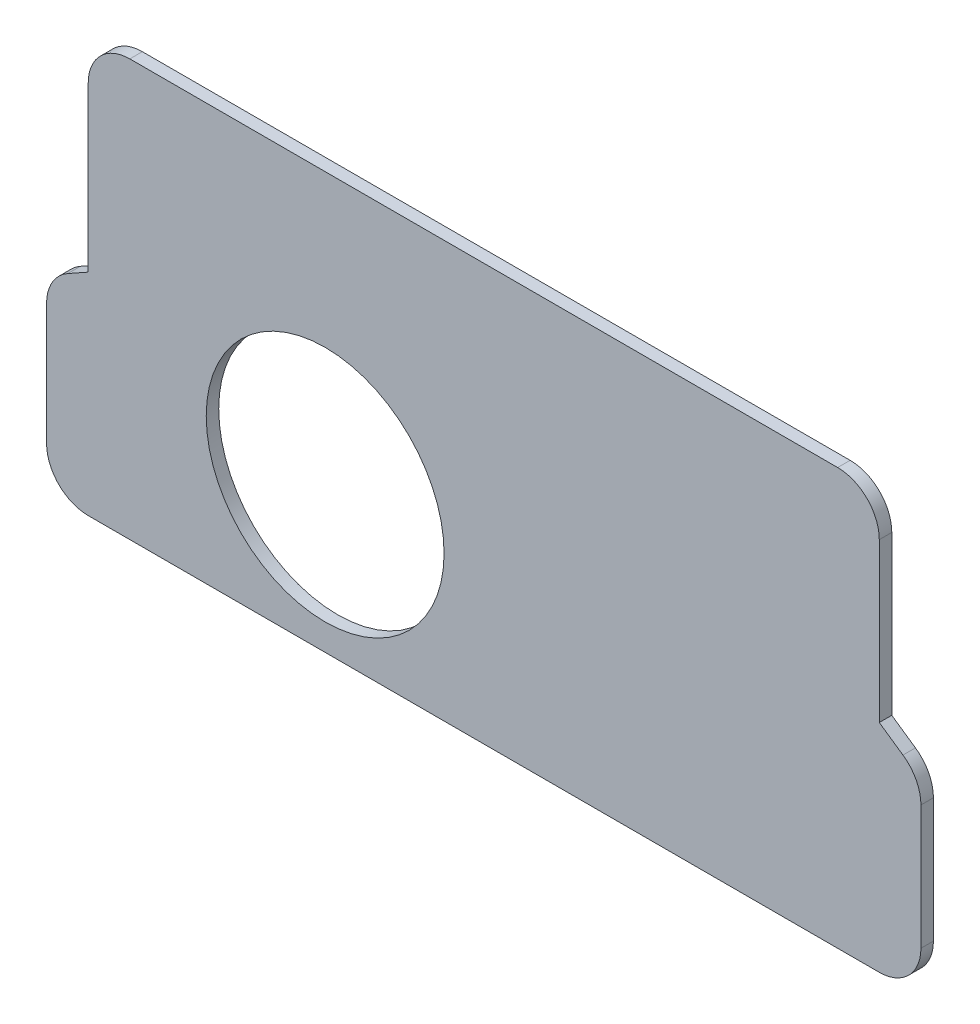
ISO-10303-21;
HEADER;
FILE_DESCRIPTION(('STEP AP214'),'2;1');
FILE_NAME('part.step','',(''),(''),'','','');
FILE_SCHEMA(('AUTOMOTIVE_DESIGN { 1 0 10303 214 1 1 1 1 }'));
ENDSEC;
DATA;
#1=APPLICATION_CONTEXT('core data for automotive mechanical design processes');
#2=APPLICATION_PROTOCOL_DEFINITION('international standard','automotive_design',2000,#1);
#3=PRODUCT_CONTEXT('',#1,'mechanical');
#4=PRODUCT('Part','Part','',(#3));
#5=PRODUCT_RELATED_PRODUCT_CATEGORY('part','',(#4));
#6=PRODUCT_DEFINITION_FORMATION('','',#4);
#7=PRODUCT_DEFINITION_CONTEXT('part definition',#1,'design');
#8=PRODUCT_DEFINITION('design','',#6,#7);
#9=PRODUCT_DEFINITION_SHAPE('','',#8);
#10=(LENGTH_UNIT() NAMED_UNIT(*) SI_UNIT(.MILLI.,.METRE.));
#11=(NAMED_UNIT(*) PLANE_ANGLE_UNIT() SI_UNIT($,.RADIAN.));
#12=(NAMED_UNIT(*) SI_UNIT($,.STERADIAN.) SOLID_ANGLE_UNIT());
#13=UNCERTAINTY_MEASURE_WITH_UNIT(LENGTH_MEASURE(1.E-05),#10,'distance_accuracy_value','');
#14=(GEOMETRIC_REPRESENTATION_CONTEXT(3) GLOBAL_UNCERTAINTY_ASSIGNED_CONTEXT((#13)) GLOBAL_UNIT_ASSIGNED_CONTEXT((#10,
#11,#12)) REPRESENTATION_CONTEXT('',''));
#15=CARTESIAN_POINT('',(0.,0.,0.));
#16=DIRECTION('',(0.,0.,1.));
#17=DIRECTION('',(1.,0.,0.));
#18=AXIS2_PLACEMENT_3D('',#15,#16,#17);
#19=CARTESIAN_POINT('',(200.,10.,3.));
#20=DIRECTION('',(0.,0.,-1.));
#21=DIRECTION('',(-1.,0.,0.));
#22=AXIS2_PLACEMENT_3D('',#19,#20,#21);
#23=PLANE('',#22);
#24=CARTESIAN_POINT('',(200.,10.,3.));
#25=DIRECTION('',(0.,0.,1.));
#26=DIRECTION('',(-1.,0.,0.));
#27=AXIS2_PLACEMENT_3D('',#24,#25,#26);
#28=CIRCLE('',#27,10.);
#29=CARTESIAN_POINT('',(200.,0.,3.));
#30=VERTEX_POINT('',#29);
#31=CARTESIAN_POINT('',(210.,10.,3.));
#32=VERTEX_POINT('',#31);
#33=EDGE_CURVE('E201',#30,#32,#28,.T.);
#34=ORIENTED_EDGE('',*,*,#33,.T.);
#35=DIRECTION('',(0.,1.,0.));
#36=VECTOR('',#35,1.);
#37=CARTESIAN_POINT('',(210.,39.8097786950727,3.));
#38=LINE('',#37,#36);
#39=CARTESIAN_POINT('',(210.,39.8097786950727,3.));
#40=VERTEX_POINT('',#39);
#41=EDGE_CURVE('E119',#32,#40,#38,.T.);
#42=ORIENTED_EDGE('',*,*,#41,.T.);
#43=CARTESIAN_POINT('',(200.,39.8097786950727,3.));
#44=DIRECTION('',(0.,0.,1.));
#45=DIRECTION('',(-1.,0.,0.));
#46=AXIS2_PLACEMENT_3D('',#43,#44,#45);
#47=CIRCLE('',#46,10.);
#48=CARTESIAN_POINT('',(205.683304945052,48.0377823959437,3.));
#49=VERTEX_POINT('',#48);
#50=EDGE_CURVE('E234',#40,#49,#47,.T.);
#51=ORIENTED_EDGE('',*,*,#50,.T.);
#52=DIRECTION('',(-0.8228003700871,0.568330494505206,0.));
#53=VECTOR('',#52,1.);
#54=CARTESIAN_POINT('',(200.,51.9633950077895,3.));
#55=LINE('',#54,#53);
#56=CARTESIAN_POINT('',(200.,51.9633950077895,3.));
#57=VERTEX_POINT('',#56);
#58=EDGE_CURVE('E253',#49,#57,#55,.T.);
#59=ORIENTED_EDGE('',*,*,#58,.T.);
#60=DIRECTION('',(0.,1.,0.));
#61=VECTOR('',#60,1.);
#62=CARTESIAN_POINT('',(200.,90.,3.));
#63=LINE('',#62,#61);
#64=CARTESIAN_POINT('',(200.,90.,3.));
#65=VERTEX_POINT('',#64);
#66=EDGE_CURVE('E250',#57,#65,#63,.T.);
#67=ORIENTED_EDGE('',*,*,#66,.T.);
#68=CARTESIAN_POINT('',(190.,90.,3.));
#69=DIRECTION('',(0.,0.,1.));
#70=DIRECTION('',(-1.,0.,0.));
#71=AXIS2_PLACEMENT_3D('',#68,#69,#70);
#72=CIRCLE('',#71,10.);
#73=CARTESIAN_POINT('',(190.,100.,3.));
#74=VERTEX_POINT('',#73);
#75=EDGE_CURVE('E252',#65,#74,#72,.T.);
#76=ORIENTED_EDGE('',*,*,#75,.T.);
#77=DIRECTION('',(-1.,0.,0.));
#78=VECTOR('',#77,1.);
#79=CARTESIAN_POINT('',(20.,100.,3.));
#80=LINE('',#79,#78);
#81=CARTESIAN_POINT('',(20.,100.,3.));
#82=VERTEX_POINT('',#81);
#83=EDGE_CURVE('E255',#74,#82,#80,.T.);
#84=ORIENTED_EDGE('',*,*,#83,.T.);
#85=CARTESIAN_POINT('',(20.,90.,3.));
#86=DIRECTION('',(0.,0.,1.));
#87=DIRECTION('',(-1.,0.,0.));
#88=AXIS2_PLACEMENT_3D('',#85,#86,#87);
#89=CIRCLE('',#88,10.);
#90=CARTESIAN_POINT('',(9.99999999999999,90.,3.));
#91=VERTEX_POINT('',#90);
#92=EDGE_CURVE('E261',#82,#91,#89,.T.);
#93=ORIENTED_EDGE('',*,*,#92,.T.);
#94=DIRECTION('',(0.,-1.,0.));
#95=VECTOR('',#94,1.);
#96=CARTESIAN_POINT('',(10.,50.6398805839343,3.));
#97=LINE('',#96,#95);
#98=CARTESIAN_POINT('',(10.,50.6398805839343,3.));
#99=VERTEX_POINT('',#98);
#100=EDGE_CURVE('E263',#91,#99,#97,.T.);
#101=ORIENTED_EDGE('',*,*,#100,.T.);
#102=DIRECTION('',(-0.873109961084315,-0.487523328524232,0.));
#103=VECTOR('',#102,1.);
#104=CARTESIAN_POINT('',(5.12476671475769,47.917669104865,3.));
#105=LINE('',#104,#103);
#106=CARTESIAN_POINT('',(5.12476671475769,47.917669104865,3.));
#107=VERTEX_POINT('',#106);
#108=EDGE_CURVE('E265',#99,#107,#105,.T.);
#109=ORIENTED_EDGE('',*,*,#108,.T.);
#110=CARTESIAN_POINT('',(10.,39.1865694940218,3.));
#111=DIRECTION('',(0.,0.,1.));
#112=DIRECTION('',(-1.,0.,0.));
#113=AXIS2_PLACEMENT_3D('',#110,#111,#112);
#114=CIRCLE('',#113,10.);
#115=CARTESIAN_POINT('',(0.,39.1865694940218,3.));
#116=VERTEX_POINT('',#115);
#117=EDGE_CURVE('E156',#107,#116,#114,.T.);
#118=ORIENTED_EDGE('',*,*,#117,.T.);
#119=DIRECTION('',(0.,-1.,0.));
#120=VECTOR('',#119,1.);
#121=CARTESIAN_POINT('',(0.,10.0000000000001,3.));
#122=LINE('',#121,#120);
#123=CARTESIAN_POINT('',(0.,10.0000000000001,3.));
#124=VERTEX_POINT('',#123);
#125=EDGE_CURVE('E150',#116,#124,#122,.T.);
#126=ORIENTED_EDGE('',*,*,#125,.T.);
#127=CARTESIAN_POINT('',(10.,10.,3.));
#128=DIRECTION('',(0.,0.,1.));
#129=DIRECTION('',(1.,0.,0.));
#130=AXIS2_PLACEMENT_3D('',#127,#128,#129);
#131=CIRCLE('',#130,10.);
#132=CARTESIAN_POINT('',(10.0000000000001,0.,3.));
#133=VERTEX_POINT('',#132);
#134=EDGE_CURVE('E154',#124,#133,#131,.T.);
#135=ORIENTED_EDGE('',*,*,#134,.T.);
#136=DIRECTION('',(1.,0.,0.));
#137=VECTOR('',#136,1.);
#138=CARTESIAN_POINT('',(200.,0.,3.));
#139=LINE('',#138,#137);
#140=EDGE_CURVE('E58',#133,#30,#139,.T.);
#141=ORIENTED_EDGE('',*,*,#140,.T.);
#142=EDGE_LOOP('',(#34,#42,#51,#59,#67,#76,#84,#93,#101,#109,#118,#126,#135,#141));
#143=FACE_BOUND('',#142,.T.);
#144=CARTESIAN_POINT('',(66.9066270388292,34.8905535477951,3.));
#145=DIRECTION('',(0.,0.,1.));
#146=DIRECTION('',(1.,0.,0.));
#147=AXIS2_PLACEMENT_3D('',#144,#145,#146);
#148=CIRCLE('',#147,28.5631780043857);
#149=CARTESIAN_POINT('',(95.4698050432149,34.8905535477951,3.));
#150=VERTEX_POINT('',#149);
#151=EDGE_CURVE('E178',#150,#150,#148,.T.);
#152=ORIENTED_EDGE('',*,*,#151,.F.);
#153=EDGE_LOOP('',(#152));
#154=FACE_BOUND('',#153,.T.);
#155=ADVANCED_FACE('F41',(#143,#154),#23,.F.);
#156=CARTESIAN_POINT('',(200.,10.,0.));
#157=DIRECTION('',(0.,0.,-1.));
#158=DIRECTION('',(-1.,0.,0.));
#159=AXIS2_PLACEMENT_3D('',#156,#157,#158);
#160=PLANE('',#159);
#161=CARTESIAN_POINT('',(200.,10.,0.));
#162=DIRECTION('',(0.,0.,1.));
#163=DIRECTION('',(-1.,0.,0.));
#164=AXIS2_PLACEMENT_3D('',#161,#162,#163);
#165=CIRCLE('',#164,10.);
#166=CARTESIAN_POINT('',(200.,0.,0.));
#167=VERTEX_POINT('',#166);
#168=CARTESIAN_POINT('',(210.,10.,0.));
#169=VERTEX_POINT('',#168);
#170=EDGE_CURVE('E174',#167,#169,#165,.T.);
#171=ORIENTED_EDGE('',*,*,#170,.F.);
#172=DIRECTION('',(1.,0.,0.));
#173=VECTOR('',#172,1.);
#174=CARTESIAN_POINT('',(200.,0.,0.));
#175=LINE('',#174,#173);
#176=CARTESIAN_POINT('',(10.0000000000001,0.,0.));
#177=VERTEX_POINT('',#176);
#178=EDGE_CURVE('E111',#177,#167,#175,.T.);
#179=ORIENTED_EDGE('',*,*,#178,.F.);
#180=CARTESIAN_POINT('',(10.,10.,0.));
#181=DIRECTION('',(0.,0.,1.));
#182=DIRECTION('',(1.,0.,0.));
#183=AXIS2_PLACEMENT_3D('',#180,#181,#182);
#184=CIRCLE('',#183,10.);
#185=CARTESIAN_POINT('',(0.,10.0000000000001,0.));
#186=VERTEX_POINT('',#185);
#187=EDGE_CURVE('E105',#186,#177,#184,.T.);
#188=ORIENTED_EDGE('',*,*,#187,.F.);
#189=DIRECTION('',(0.,-1.,0.));
#190=VECTOR('',#189,1.);
#191=CARTESIAN_POINT('',(0.,10.0000000000001,0.));
#192=LINE('',#191,#190);
#193=CARTESIAN_POINT('',(0.,39.1865694940218,0.));
#194=VERTEX_POINT('',#193);
#195=EDGE_CURVE('E164',#194,#186,#192,.T.);
#196=ORIENTED_EDGE('',*,*,#195,.F.);
#197=CARTESIAN_POINT('',(10.,39.1865694940218,0.));
#198=DIRECTION('',(0.,0.,1.));
#199=DIRECTION('',(-1.,0.,0.));
#200=AXIS2_PLACEMENT_3D('',#197,#198,#199);
#201=CIRCLE('',#200,10.);
#202=CARTESIAN_POINT('',(5.12476671475769,47.917669104865,0.));
#203=VERTEX_POINT('',#202);
#204=EDGE_CURVE('E196',#203,#194,#201,.T.);
#205=ORIENTED_EDGE('',*,*,#204,.F.);
#206=DIRECTION('',(-0.873109961084315,-0.487523328524232,0.));
#207=VECTOR('',#206,1.);
#208=CARTESIAN_POINT('',(5.12476671475769,47.917669104865,0.));
#209=LINE('',#208,#207);
#210=CARTESIAN_POINT('',(10.,50.6398805839343,0.));
#211=VERTEX_POINT('',#210);
#212=EDGE_CURVE('E194',#211,#203,#209,.T.);
#213=ORIENTED_EDGE('',*,*,#212,.F.);
#214=DIRECTION('',(0.,-1.,0.));
#215=VECTOR('',#214,1.);
#216=CARTESIAN_POINT('',(10.,50.6398805839343,0.));
#217=LINE('',#216,#215);
#218=CARTESIAN_POINT('',(9.99999999999999,90.,0.));
#219=VERTEX_POINT('',#218);
#220=EDGE_CURVE('E192',#219,#211,#217,.T.);
#221=ORIENTED_EDGE('',*,*,#220,.F.);
#222=CARTESIAN_POINT('',(20.,90.,0.));
#223=DIRECTION('',(0.,0.,1.));
#224=DIRECTION('',(-1.,0.,0.));
#225=AXIS2_PLACEMENT_3D('',#222,#223,#224);
#226=CIRCLE('',#225,10.);
#227=CARTESIAN_POINT('',(20.,100.,0.));
#228=VERTEX_POINT('',#227);
#229=EDGE_CURVE('E190',#228,#219,#226,.T.);
#230=ORIENTED_EDGE('',*,*,#229,.F.);
#231=DIRECTION('',(-1.,0.,0.));
#232=VECTOR('',#231,1.);
#233=CARTESIAN_POINT('',(20.,100.,0.));
#234=LINE('',#233,#232);
#235=CARTESIAN_POINT('',(190.,100.,0.));
#236=VERTEX_POINT('',#235);
#237=EDGE_CURVE('E188',#236,#228,#234,.T.);
#238=ORIENTED_EDGE('',*,*,#237,.F.);
#239=CARTESIAN_POINT('',(190.,90.,0.));
#240=DIRECTION('',(0.,0.,1.));
#241=DIRECTION('',(-1.,0.,0.));
#242=AXIS2_PLACEMENT_3D('',#239,#240,#241);
#243=CIRCLE('',#242,10.);
#244=CARTESIAN_POINT('',(200.,90.,0.));
#245=VERTEX_POINT('',#244);
#246=EDGE_CURVE('E186',#245,#236,#243,.T.);
#247=ORIENTED_EDGE('',*,*,#246,.F.);
#248=DIRECTION('',(0.,1.,0.));
#249=VECTOR('',#248,1.);
#250=CARTESIAN_POINT('',(200.,90.,0.));
#251=LINE('',#250,#249);
#252=CARTESIAN_POINT('',(200.,51.9633950077895,0.));
#253=VERTEX_POINT('',#252);
#254=EDGE_CURVE('E184',#253,#245,#251,.T.);
#255=ORIENTED_EDGE('',*,*,#254,.F.);
#256=DIRECTION('',(-0.8228003700871,0.568330494505206,0.));
#257=VECTOR('',#256,1.);
#258=CARTESIAN_POINT('',(200.,51.9633950077895,0.));
#259=LINE('',#258,#257);
#260=CARTESIAN_POINT('',(205.683304945052,48.0377823959437,0.));
#261=VERTEX_POINT('',#260);
#262=EDGE_CURVE('E182',#261,#253,#259,.T.);
#263=ORIENTED_EDGE('',*,*,#262,.F.);
#264=CARTESIAN_POINT('',(200.,39.8097786950727,0.));
#265=DIRECTION('',(0.,0.,1.));
#266=DIRECTION('',(-1.,0.,0.));
#267=AXIS2_PLACEMENT_3D('',#264,#265,#266);
#268=CIRCLE('',#267,10.);
#269=CARTESIAN_POINT('',(210.,39.8097786950727,0.));
#270=VERTEX_POINT('',#269);
#271=EDGE_CURVE('E180',#270,#261,#268,.T.);
#272=ORIENTED_EDGE('',*,*,#271,.F.);
#273=DIRECTION('',(0.,1.,0.));
#274=VECTOR('',#273,1.);
#275=CARTESIAN_POINT('',(210.,39.8097786950727,0.));
#276=LINE('',#275,#274);
#277=EDGE_CURVE('E177',#169,#270,#276,.T.);
#278=ORIENTED_EDGE('',*,*,#277,.F.);
#279=EDGE_LOOP('',(#171,#179,#188,#196,#205,#213,#221,#230,#238,#247,#255,#263,#272,#278));
#280=FACE_BOUND('',#279,.T.);
#281=CARTESIAN_POINT('',(66.9066270388292,34.8905535477951,0.));
#282=DIRECTION('',(0.,0.,1.));
#283=DIRECTION('',(1.,0.,0.));
#284=AXIS2_PLACEMENT_3D('',#281,#282,#283);
#285=CIRCLE('',#284,28.5631780043857);
#286=CARTESIAN_POINT('',(95.4698050432149,34.8905535477951,0.));
#287=VERTEX_POINT('',#286);
#288=EDGE_CURVE('E438',#287,#287,#285,.T.);
#289=ORIENTED_EDGE('',*,*,#288,.T.);
#290=EDGE_LOOP('',(#289));
#291=FACE_BOUND('',#290,.T.);
#292=ADVANCED_FACE('F238',(#280,#291),#160,.T.);
#293=CARTESIAN_POINT('',(200.,10.,3.));
#294=DIRECTION('',(0.,0.,-1.));
#295=DIRECTION('',(-1.,0.,0.));
#296=AXIS2_PLACEMENT_3D('',#293,#294,#295);
#297=CYLINDRICAL_SURFACE('',#296,10.);
#298=ORIENTED_EDGE('',*,*,#170,.T.);
#299=DIRECTION('',(0.,0.,-1.));
#300=VECTOR('',#299,1.);
#301=CARTESIAN_POINT('',(210.,10.,3.));
#302=LINE('',#301,#300);
#303=EDGE_CURVE('E11',#32,#169,#302,.T.);
#304=ORIENTED_EDGE('',*,*,#303,.F.);
#305=ORIENTED_EDGE('',*,*,#33,.F.);
#306=DIRECTION('',(0.,0.,-1.));
#307=VECTOR('',#306,1.);
#308=CARTESIAN_POINT('',(200.,0.,3.));
#309=LINE('',#308,#307);
#310=EDGE_CURVE('E170',#30,#167,#309,.T.);
#311=ORIENTED_EDGE('',*,*,#310,.T.);
#312=EDGE_LOOP('',(#298,#304,#305,#311));
#313=FACE_BOUND('',#312,.T.);
#314=ADVANCED_FACE('F43',(#313),#297,.T.);
#315=CARTESIAN_POINT('',(210.,39.8097786950727,3.));
#316=DIRECTION('',(-1.,0.,0.));
#317=DIRECTION('',(0.,0.,1.));
#318=AXIS2_PLACEMENT_3D('',#315,#316,#317);
#319=PLANE('',#318);
#320=ORIENTED_EDGE('',*,*,#277,.T.);
#321=DIRECTION('',(0.,0.,-1.));
#322=VECTOR('',#321,1.);
#323=CARTESIAN_POINT('',(210.,39.8097786950727,3.));
#324=LINE('',#323,#322);
#325=EDGE_CURVE('E50',#40,#270,#324,.T.);
#326=ORIENTED_EDGE('',*,*,#325,.F.);
#327=ORIENTED_EDGE('',*,*,#41,.F.);
#328=ORIENTED_EDGE('',*,*,#303,.T.);
#329=EDGE_LOOP('',(#320,#326,#327,#328));
#330=FACE_BOUND('',#329,.T.);
#331=ADVANCED_FACE('F299',(#330),#319,.F.);
#332=CARTESIAN_POINT('',(200.,39.8097786950727,3.));
#333=DIRECTION('',(0.,0.,-1.));
#334=DIRECTION('',(-1.,0.,0.));
#335=AXIS2_PLACEMENT_3D('',#332,#333,#334);
#336=CYLINDRICAL_SURFACE('',#335,10.);
#337=ORIENTED_EDGE('',*,*,#271,.T.);
#338=DIRECTION('',(0.,0.,-1.));
#339=VECTOR('',#338,1.);
#340=CARTESIAN_POINT('',(205.683304945052,48.0377823959437,3.));
#341=LINE('',#340,#339);
#342=EDGE_CURVE('E226',#49,#261,#341,.T.);
#343=ORIENTED_EDGE('',*,*,#342,.F.);
#344=ORIENTED_EDGE('',*,*,#50,.F.);
#345=ORIENTED_EDGE('',*,*,#325,.T.);
#346=EDGE_LOOP('',(#337,#343,#344,#345));
#347=FACE_BOUND('',#346,.T.);
#348=ADVANCED_FACE('F232',(#347),#336,.T.);
#349=CARTESIAN_POINT('',(200.,51.9633950077895,3.));
#350=DIRECTION('',(-0.568330494505206,-0.8228003700871,0.));
#351=DIRECTION('',(0.8228003700871,-0.568330494505206,0.));
#352=AXIS2_PLACEMENT_3D('',#349,#350,#351);
#353=PLANE('',#352);
#354=ORIENTED_EDGE('',*,*,#262,.T.);
#355=DIRECTION('',(0.,0.,-1.));
#356=VECTOR('',#355,1.);
#357=CARTESIAN_POINT('',(200.,51.9633950077895,3.));
#358=LINE('',#357,#356);
#359=EDGE_CURVE('E223',#57,#253,#358,.T.);
#360=ORIENTED_EDGE('',*,*,#359,.F.);
#361=ORIENTED_EDGE('',*,*,#58,.F.);
#362=ORIENTED_EDGE('',*,*,#342,.T.);
#363=EDGE_LOOP('',(#354,#360,#361,#362));
#364=FACE_BOUND('',#363,.T.);
#365=ADVANCED_FACE('F244',(#364),#353,.F.);
#366=CARTESIAN_POINT('',(200.,90.,3.));
#367=DIRECTION('',(-1.,0.,0.));
#368=DIRECTION('',(0.,0.,1.));
#369=AXIS2_PLACEMENT_3D('',#366,#367,#368);
#370=PLANE('',#369);
#371=ORIENTED_EDGE('',*,*,#254,.T.);
#372=DIRECTION('',(0.,0.,-1.));
#373=VECTOR('',#372,1.);
#374=CARTESIAN_POINT('',(200.,90.,3.));
#375=LINE('',#374,#373);
#376=EDGE_CURVE('E220',#65,#245,#375,.T.);
#377=ORIENTED_EDGE('',*,*,#376,.F.);
#378=ORIENTED_EDGE('',*,*,#66,.F.);
#379=ORIENTED_EDGE('',*,*,#359,.T.);
#380=EDGE_LOOP('',(#371,#377,#378,#379));
#381=FACE_BOUND('',#380,.T.);
#382=ADVANCED_FACE('F248',(#381),#370,.F.);
#383=CARTESIAN_POINT('',(190.,90.,3.));
#384=DIRECTION('',(0.,0.,-1.));
#385=DIRECTION('',(-1.,0.,0.));
#386=AXIS2_PLACEMENT_3D('',#383,#384,#385);
#387=CYLINDRICAL_SURFACE('',#386,10.);
#388=ORIENTED_EDGE('',*,*,#246,.T.);
#389=DIRECTION('',(0.,0.,-1.));
#390=VECTOR('',#389,1.);
#391=CARTESIAN_POINT('',(190.,100.,3.));
#392=LINE('',#391,#390);
#393=EDGE_CURVE('E217',#74,#236,#392,.T.);
#394=ORIENTED_EDGE('',*,*,#393,.F.);
#395=ORIENTED_EDGE('',*,*,#75,.F.);
#396=ORIENTED_EDGE('',*,*,#376,.T.);
#397=EDGE_LOOP('',(#388,#394,#395,#396));
#398=FACE_BOUND('',#397,.T.);
#399=ADVANCED_FACE('F312',(#398),#387,.T.);
#400=CARTESIAN_POINT('',(20.,100.,3.));
#401=DIRECTION('',(0.,-1.,0.));
#402=DIRECTION('',(1.,0.,0.));
#403=AXIS2_PLACEMENT_3D('',#400,#401,#402);
#404=PLANE('',#403);
#405=ORIENTED_EDGE('',*,*,#237,.T.);
#406=DIRECTION('',(0.,0.,-1.));
#407=VECTOR('',#406,1.);
#408=CARTESIAN_POINT('',(20.,100.,3.));
#409=LINE('',#408,#407);
#410=EDGE_CURVE('E214',#82,#228,#409,.T.);
#411=ORIENTED_EDGE('',*,*,#410,.F.);
#412=ORIENTED_EDGE('',*,*,#83,.F.);
#413=ORIENTED_EDGE('',*,*,#393,.T.);
#414=EDGE_LOOP('',(#405,#411,#412,#413));
#415=FACE_BOUND('',#414,.T.);
#416=ADVANCED_FACE('F315',(#415),#404,.F.);
#417=CARTESIAN_POINT('',(20.,90.,3.));
#418=DIRECTION('',(0.,0.,-1.));
#419=DIRECTION('',(-1.,0.,0.));
#420=AXIS2_PLACEMENT_3D('',#417,#418,#419);
#421=CYLINDRICAL_SURFACE('',#420,10.);
#422=ORIENTED_EDGE('',*,*,#229,.T.);
#423=DIRECTION('',(0.,0.,-1.));
#424=VECTOR('',#423,1.);
#425=CARTESIAN_POINT('',(9.99999999999999,90.,3.));
#426=LINE('',#425,#424);
#427=EDGE_CURVE('E211',#91,#219,#426,.T.);
#428=ORIENTED_EDGE('',*,*,#427,.F.);
#429=ORIENTED_EDGE('',*,*,#92,.F.);
#430=ORIENTED_EDGE('',*,*,#410,.T.);
#431=EDGE_LOOP('',(#422,#428,#429,#430));
#432=FACE_BOUND('',#431,.T.);
#433=ADVANCED_FACE('F319',(#432),#421,.T.);
#434=CARTESIAN_POINT('',(10.,50.6398805839343,3.));
#435=DIRECTION('',(1.,0.,0.));
#436=DIRECTION('',(0.,1.,0.));
#437=AXIS2_PLACEMENT_3D('',#434,#435,#436);
#438=PLANE('',#437);
#439=ORIENTED_EDGE('',*,*,#220,.T.);
#440=DIRECTION('',(0.,0.,-1.));
#441=VECTOR('',#440,1.);
#442=CARTESIAN_POINT('',(10.,50.6398805839343,3.));
#443=LINE('',#442,#441);
#444=EDGE_CURVE('E208',#99,#211,#443,.T.);
#445=ORIENTED_EDGE('',*,*,#444,.F.);
#446=ORIENTED_EDGE('',*,*,#100,.F.);
#447=ORIENTED_EDGE('',*,*,#427,.T.);
#448=EDGE_LOOP('',(#439,#445,#446,#447));
#449=FACE_BOUND('',#448,.T.);
#450=ADVANCED_FACE('F323',(#449),#438,.F.);
#451=CARTESIAN_POINT('',(5.12476671475769,47.917669104865,3.));
#452=DIRECTION('',(0.487523328524232,-0.873109961084315,0.));
#453=DIRECTION('',(0.873109961084315,0.487523328524232,0.));
#454=AXIS2_PLACEMENT_3D('',#451,#452,#453);
#455=PLANE('',#454);
#456=ORIENTED_EDGE('',*,*,#212,.T.);
#457=DIRECTION('',(0.,0.,-1.));
#458=VECTOR('',#457,1.);
#459=CARTESIAN_POINT('',(5.12476671475769,47.917669104865,3.));
#460=LINE('',#459,#458);
#461=EDGE_CURVE('E205',#107,#203,#460,.T.);
#462=ORIENTED_EDGE('',*,*,#461,.F.);
#463=ORIENTED_EDGE('',*,*,#108,.F.);
#464=ORIENTED_EDGE('',*,*,#444,.T.);
#465=EDGE_LOOP('',(#456,#462,#463,#464));
#466=FACE_BOUND('',#465,.T.);
#467=ADVANCED_FACE('F271',(#466),#455,.F.);
#468=CARTESIAN_POINT('',(10.,39.1865694940218,3.));
#469=DIRECTION('',(0.,0.,-1.));
#470=DIRECTION('',(-1.,0.,0.));
#471=AXIS2_PLACEMENT_3D('',#468,#469,#470);
#472=CYLINDRICAL_SURFACE('',#471,10.);
#473=ORIENTED_EDGE('',*,*,#204,.T.);
#474=DIRECTION('',(0.,0.,-1.));
#475=VECTOR('',#474,1.);
#476=CARTESIAN_POINT('',(0.,39.1865694940218,3.));
#477=LINE('',#476,#475);
#478=EDGE_CURVE('E165',#116,#194,#477,.T.);
#479=ORIENTED_EDGE('',*,*,#478,.F.);
#480=ORIENTED_EDGE('',*,*,#117,.F.);
#481=ORIENTED_EDGE('',*,*,#461,.T.);
#482=EDGE_LOOP('',(#473,#479,#480,#481));
#483=FACE_BOUND('',#482,.T.);
#484=ADVANCED_FACE('F275',(#483),#472,.T.);
#485=CARTESIAN_POINT('',(0.,10.0000000000001,3.));
#486=DIRECTION('',(1.,0.,0.));
#487=DIRECTION('',(0.,0.,-1.));
#488=AXIS2_PLACEMENT_3D('',#485,#486,#487);
#489=PLANE('',#488);
#490=ORIENTED_EDGE('',*,*,#195,.T.);
#491=DIRECTION('',(0.,0.,-1.));
#492=VECTOR('',#491,1.);
#493=CARTESIAN_POINT('',(0.,10.0000000000001,3.));
#494=LINE('',#493,#492);
#495=EDGE_CURVE('E161',#124,#186,#494,.T.);
#496=ORIENTED_EDGE('',*,*,#495,.F.);
#497=ORIENTED_EDGE('',*,*,#125,.F.);
#498=ORIENTED_EDGE('',*,*,#478,.T.);
#499=EDGE_LOOP('',(#490,#496,#497,#498));
#500=FACE_BOUND('',#499,.T.);
#501=ADVANCED_FACE('F162',(#500),#489,.F.);
#502=CARTESIAN_POINT('',(10.,10.,3.));
#503=DIRECTION('',(0.,0.,-1.));
#504=DIRECTION('',(-1.,0.,0.));
#505=AXIS2_PLACEMENT_3D('',#502,#503,#504);
#506=CYLINDRICAL_SURFACE('',#505,10.);
#507=ORIENTED_EDGE('',*,*,#187,.T.);
#508=DIRECTION('',(0.,0.,-1.));
#509=VECTOR('',#508,1.);
#510=CARTESIAN_POINT('',(10.0000000000001,0.,3.));
#511=LINE('',#510,#509);
#512=EDGE_CURVE('E166',#133,#177,#511,.T.);
#513=ORIENTED_EDGE('',*,*,#512,.F.);
#514=ORIENTED_EDGE('',*,*,#134,.F.);
#515=ORIENTED_EDGE('',*,*,#495,.T.);
#516=EDGE_LOOP('',(#507,#513,#514,#515));
#517=FACE_BOUND('',#516,.T.);
#518=ADVANCED_FACE('F168',(#517),#506,.T.);
#519=CARTESIAN_POINT('',(200.,0.,3.));
#520=DIRECTION('',(0.,1.,0.));
#521=DIRECTION('',(-1.,0.,0.));
#522=AXIS2_PLACEMENT_3D('',#519,#520,#521);
#523=PLANE('',#522);
#524=ORIENTED_EDGE('',*,*,#178,.T.);
#525=ORIENTED_EDGE('',*,*,#310,.F.);
#526=ORIENTED_EDGE('',*,*,#140,.F.);
#527=ORIENTED_EDGE('',*,*,#512,.T.);
#528=EDGE_LOOP('',(#524,#525,#526,#527));
#529=FACE_BOUND('',#528,.T.);
#530=ADVANCED_FACE('F279',(#529),#523,.F.);
#531=CARTESIAN_POINT('',(66.9066270388292,34.8905535477951,3.));
#532=DIRECTION('',(0.,0.,-1.));
#533=DIRECTION('',(-1.,0.,0.));
#534=AXIS2_PLACEMENT_3D('',#531,#532,#533);
#535=CYLINDRICAL_SURFACE('',#534,28.5631780043857);
#536=ORIENTED_EDGE('',*,*,#151,.T.);
#537=EDGE_LOOP('',(#536));
#538=FACE_BOUND('',#537,.T.);
#539=ORIENTED_EDGE('',*,*,#288,.F.);
#540=EDGE_LOOP('',(#539));
#541=FACE_BOUND('',#540,.T.);
#542=ADVANCED_FACE('F281',(#538,#541),#535,.F.);
#543=CLOSED_SHELL('',(#155,#292,#314,#331,#348,#365,#382,#399,#416,#433,#450,#467,#484,#501,
#518,#530,#542));
#544=MANIFOLD_SOLID_BREP('B2',#543);
#545=ADVANCED_BREP_SHAPE_REPRESENTATION('',(#18,#544),#14);
#546=SHAPE_DEFINITION_REPRESENTATION(#9,#545);
ENDSEC;
END-ISO-10303-21;
